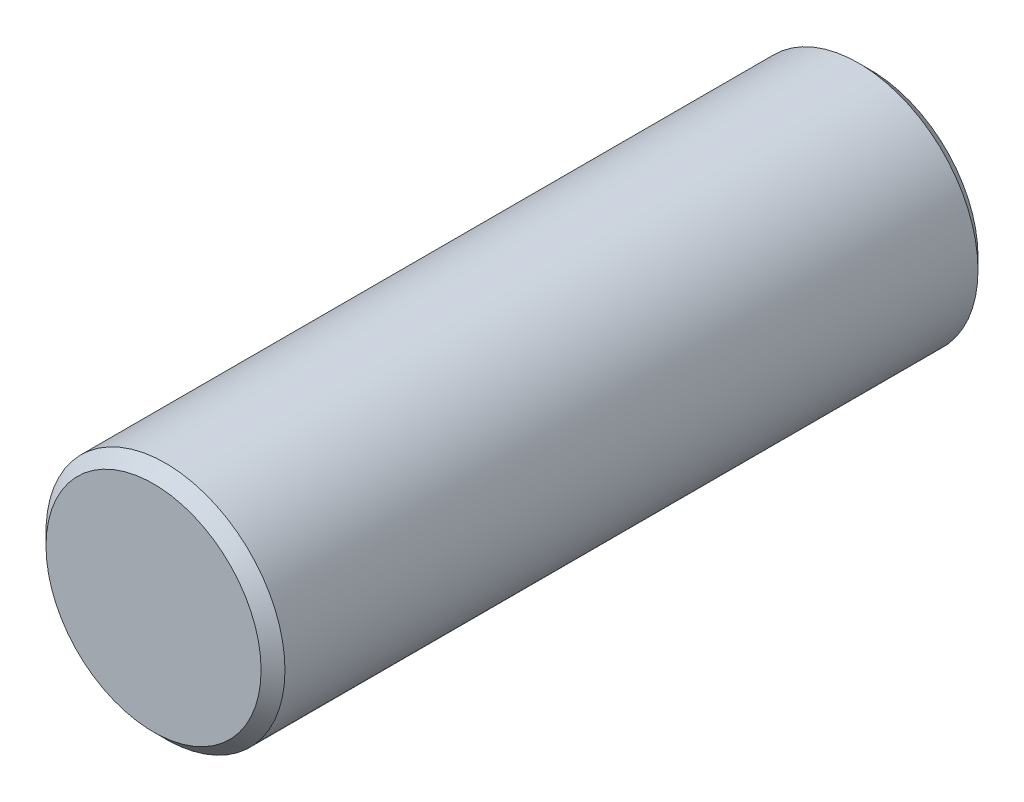
ISO-10303-21;
HEADER;
FILE_DESCRIPTION(('STEP AP214'),'2;1');
FILE_NAME('part.step','',(''),(''),'','','');
FILE_SCHEMA(('AUTOMOTIVE_DESIGN { 1 0 10303 214 1 1 1 1 }'));
ENDSEC;
DATA;
#1=APPLICATION_CONTEXT('core data for automotive mechanical design processes');
#2=APPLICATION_PROTOCOL_DEFINITION('international standard','automotive_design',2000,#1);
#3=PRODUCT_CONTEXT('',#1,'mechanical');
#4=PRODUCT('Part','Part','',(#3));
#5=PRODUCT_RELATED_PRODUCT_CATEGORY('part','',(#4));
#6=PRODUCT_DEFINITION_FORMATION('','',#4);
#7=PRODUCT_DEFINITION_CONTEXT('part definition',#1,'design');
#8=PRODUCT_DEFINITION('design','',#6,#7);
#9=PRODUCT_DEFINITION_SHAPE('','',#8);
#10=(LENGTH_UNIT() NAMED_UNIT(*) SI_UNIT(.MILLI.,.METRE.));
#11=(NAMED_UNIT(*) PLANE_ANGLE_UNIT() SI_UNIT($,.RADIAN.));
#12=(NAMED_UNIT(*) SI_UNIT($,.STERADIAN.) SOLID_ANGLE_UNIT());
#13=UNCERTAINTY_MEASURE_WITH_UNIT(LENGTH_MEASURE(1.E-05),#10,'distance_accuracy_value','');
#14=(GEOMETRIC_REPRESENTATION_CONTEXT(3) GLOBAL_UNCERTAINTY_ASSIGNED_CONTEXT((#13)) GLOBAL_UNIT_ASSIGNED_CONTEXT((#10,
#11,#12)) REPRESENTATION_CONTEXT('',''));
#15=CARTESIAN_POINT('',(0.,0.,0.));
#16=DIRECTION('',(0.,0.,1.));
#17=DIRECTION('',(1.,0.,0.));
#18=AXIS2_PLACEMENT_3D('',#15,#16,#17);
#19=CARTESIAN_POINT('',(0.,0.,60.));
#20=DIRECTION('',(0.,0.,-1.));
#21=DIRECTION('',(-1.,0.,0.));
#22=AXIS2_PLACEMENT_3D('',#19,#20,#21);
#23=CYLINDRICAL_SURFACE('',#22,10.);
#24=CARTESIAN_POINT('',(0.,0.,1.00000000000001));
#25=DIRECTION('',(0.,0.,1.));
#26=DIRECTION('',(1.,0.,0.));
#27=AXIS2_PLACEMENT_3D('',#24,#25,#26);
#28=CIRCLE('',#27,10.);
#29=CARTESIAN_POINT('',(10.,0.,1.00000000000001));
#30=VERTEX_POINT('',#29);
#31=EDGE_CURVE('E44',#30,#30,#28,.T.);
#32=ORIENTED_EDGE('',*,*,#31,.T.);
#33=EDGE_LOOP('',(#32));
#34=FACE_BOUND('',#33,.T.);
#35=CARTESIAN_POINT('',(0.,0.,59.));
#36=DIRECTION('',(0.,0.,1.));
#37=DIRECTION('',(1.,0.,0.));
#38=AXIS2_PLACEMENT_3D('',#35,#36,#37);
#39=CIRCLE('',#38,10.);
#40=CARTESIAN_POINT('',(10.,0.,59.));
#41=VERTEX_POINT('',#40);
#42=EDGE_CURVE('E48',#41,#41,#39,.F.);
#43=ORIENTED_EDGE('',*,*,#42,.T.);
#44=EDGE_LOOP('',(#43));
#45=FACE_BOUND('',#44,.T.);
#46=ADVANCED_FACE('F33',(#34,#45),#23,.T.);
#47=CARTESIAN_POINT('',(0.,0.,60.));
#48=DIRECTION('',(0.,0.,1.));
#49=DIRECTION('',(1.,0.,0.));
#50=AXIS2_PLACEMENT_3D('',#47,#48,#49);
#51=PLANE('',#50);
#52=CARTESIAN_POINT('',(0.,0.,60.));
#53=DIRECTION('',(0.,0.,1.));
#54=DIRECTION('',(1.,0.,0.));
#55=AXIS2_PLACEMENT_3D('',#52,#53,#54);
#56=CIRCLE('',#55,9.);
#57=CARTESIAN_POINT('',(9.,0.,60.));
#58=VERTEX_POINT('',#57);
#59=EDGE_CURVE('E10',#58,#58,#56,.T.);
#60=ORIENTED_EDGE('',*,*,#59,.T.);
#61=EDGE_LOOP('',(#60));
#62=FACE_BOUND('',#61,.T.);
#63=ADVANCED_FACE('F64',(#62),#51,.T.);
#64=CARTESIAN_POINT('',(0.,0.,0.));
#65=DIRECTION('',(0.,0.,1.));
#66=DIRECTION('',(1.,0.,0.));
#67=AXIS2_PLACEMENT_3D('',#64,#65,#66);
#68=PLANE('',#67);
#69=CARTESIAN_POINT('',(0.,0.,0.));
#70=DIRECTION('',(0.,0.,1.));
#71=DIRECTION('',(1.,0.,0.));
#72=AXIS2_PLACEMENT_3D('',#69,#70,#71);
#73=CIRCLE('',#72,8.99999999999999);
#74=CARTESIAN_POINT('',(8.99999999999999,0.,0.));
#75=VERTEX_POINT('',#74);
#76=EDGE_CURVE('E40',#75,#75,#73,.F.);
#77=ORIENTED_EDGE('',*,*,#76,.T.);
#78=EDGE_LOOP('',(#77));
#79=FACE_BOUND('',#78,.T.);
#80=ADVANCED_FACE('F61',(#79),#68,.F.);
#81=CARTESIAN_POINT('',(0.,0.,1.00000000000001));
#82=DIRECTION('',(0.,0.,1.));
#83=DIRECTION('',(1.,0.,0.));
#84=AXIS2_PLACEMENT_3D('',#81,#82,#83);
#85=CONICAL_SURFACE('',#84,10.,0.785398163397451);
#86=ORIENTED_EDGE('',*,*,#76,.F.);
#87=EDGE_LOOP('',(#86));
#88=FACE_BOUND('',#87,.T.);
#89=ORIENTED_EDGE('',*,*,#31,.F.);
#90=EDGE_LOOP('',(#89));
#91=FACE_BOUND('',#90,.T.);
#92=ADVANCED_FACE('F57',(#88,#91),#85,.T.);
#93=CARTESIAN_POINT('',(0.,0.,60.));
#94=DIRECTION('',(0.,0.,-1.));
#95=DIRECTION('',(-1.,0.,0.));
#96=AXIS2_PLACEMENT_3D('',#93,#94,#95);
#97=CONICAL_SURFACE('',#96,9.,0.785398163397451);
#98=ORIENTED_EDGE('',*,*,#42,.F.);
#99=EDGE_LOOP('',(#98));
#100=FACE_BOUND('',#99,.T.);
#101=ORIENTED_EDGE('',*,*,#59,.F.);
#102=EDGE_LOOP('',(#101));
#103=FACE_BOUND('',#102,.T.);
#104=ADVANCED_FACE('F35',(#100,#103),#97,.T.);
#105=CLOSED_SHELL('',(#46,#63,#80,#92,#104));
#106=MANIFOLD_SOLID_BREP('B2',#105);
#107=ADVANCED_BREP_SHAPE_REPRESENTATION('',(#18,#106),#14);
#108=SHAPE_DEFINITION_REPRESENTATION(#9,#107);
ENDSEC;
END-ISO-10303-21;
